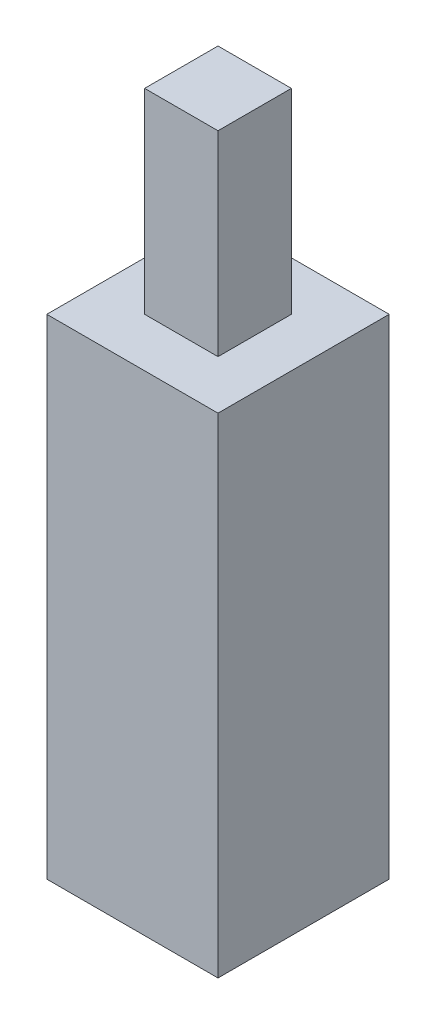
ISO-10303-21;
HEADER;
FILE_DESCRIPTION(('STEP AP214'),'2;1');
FILE_NAME('part.step','',(''),(''),'','','');
FILE_SCHEMA(('AUTOMOTIVE_DESIGN { 1 0 10303 214 1 1 1 1 }'));
ENDSEC;
DATA;
#1=APPLICATION_CONTEXT('core data for automotive mechanical design processes');
#2=APPLICATION_PROTOCOL_DEFINITION('international standard','automotive_design',2000,#1);
#3=PRODUCT_CONTEXT('',#1,'mechanical');
#4=PRODUCT('Part','Part','',(#3));
#5=PRODUCT_RELATED_PRODUCT_CATEGORY('part','',(#4));
#6=PRODUCT_DEFINITION_FORMATION('','',#4);
#7=PRODUCT_DEFINITION_CONTEXT('part definition',#1,'design');
#8=PRODUCT_DEFINITION('design','',#6,#7);
#9=PRODUCT_DEFINITION_SHAPE('','',#8);
#10=(LENGTH_UNIT() NAMED_UNIT(*) SI_UNIT(.MILLI.,.METRE.));
#11=(NAMED_UNIT(*) PLANE_ANGLE_UNIT() SI_UNIT($,.RADIAN.));
#12=(NAMED_UNIT(*) SI_UNIT($,.STERADIAN.) SOLID_ANGLE_UNIT());
#13=UNCERTAINTY_MEASURE_WITH_UNIT(LENGTH_MEASURE(1.E-05),#10,'distance_accuracy_value','');
#14=(GEOMETRIC_REPRESENTATION_CONTEXT(3) GLOBAL_UNCERTAINTY_ASSIGNED_CONTEXT((#13)) GLOBAL_UNIT_ASSIGNED_CONTEXT((#10,
#11,#12)) REPRESENTATION_CONTEXT('',''));
#15=CARTESIAN_POINT('',(0.,0.,0.));
#16=DIRECTION('',(0.,0.,1.));
#17=DIRECTION('',(1.,0.,0.));
#18=AXIS2_PLACEMENT_3D('',#15,#16,#17);
#19=CARTESIAN_POINT('',(0.,20.,0.));
#20=DIRECTION('',(0.,-1.,0.));
#21=DIRECTION('',(0.,0.,-1.));
#22=AXIS2_PLACEMENT_3D('',#19,#20,#21);
#23=PLANE('',#22);
#24=DIRECTION('',(0.,0.,1.));
#25=VECTOR('',#24,1.);
#26=CARTESIAN_POINT('',(0.,20.,0.));
#27=LINE('',#26,#25);
#28=CARTESIAN_POINT('',(0.,20.,-7.));
#29=VERTEX_POINT('',#28);
#30=CARTESIAN_POINT('',(0.,20.,0.));
#31=VERTEX_POINT('',#30);
#32=EDGE_CURVE('E127',#29,#31,#27,.T.);
#33=ORIENTED_EDGE('',*,*,#32,.T.);
#34=DIRECTION('',(1.,0.,0.));
#35=VECTOR('',#34,1.);
#36=CARTESIAN_POINT('',(0.,20.,0.));
#37=LINE('',#36,#35);
#38=CARTESIAN_POINT('',(7.,20.,0.));
#39=VERTEX_POINT('',#38);
#40=EDGE_CURVE('E130',#31,#39,#37,.T.);
#41=ORIENTED_EDGE('',*,*,#40,.T.);
#42=DIRECTION('',(0.,0.,-1.));
#43=VECTOR('',#42,1.);
#44=CARTESIAN_POINT('',(7.,20.,0.));
#45=LINE('',#44,#43);
#46=CARTESIAN_POINT('',(7.,20.,-7.));
#47=VERTEX_POINT('',#46);
#48=EDGE_CURVE('E133',#39,#47,#45,.T.);
#49=ORIENTED_EDGE('',*,*,#48,.T.);
#50=DIRECTION('',(-1.,0.,0.));
#51=VECTOR('',#50,1.);
#52=CARTESIAN_POINT('',(0.,20.,-7.));
#53=LINE('',#52,#51);
#54=EDGE_CURVE('E135',#47,#29,#53,.T.);
#55=ORIENTED_EDGE('',*,*,#54,.T.);
#56=EDGE_LOOP('',(#33,#41,#49,#55));
#57=FACE_BOUND('',#56,.T.);
#58=DIRECTION('',(0.,0.,1.));
#59=VECTOR('',#58,1.);
#60=CARTESIAN_POINT('',(2.,20.,-2.));
#61=LINE('',#60,#59);
#62=CARTESIAN_POINT('',(2.,20.,-5.));
#63=VERTEX_POINT('',#62);
#64=CARTESIAN_POINT('',(2.,20.,-2.));
#65=VERTEX_POINT('',#64);
#66=EDGE_CURVE('E48',#63,#65,#61,.T.);
#67=ORIENTED_EDGE('',*,*,#66,.F.);
#68=DIRECTION('',(-1.,0.,0.));
#69=VECTOR('',#68,1.);
#70=CARTESIAN_POINT('',(2.,20.,-5.));
#71=LINE('',#70,#69);
#72=CARTESIAN_POINT('',(5.,20.,-5.));
#73=VERTEX_POINT('',#72);
#74=EDGE_CURVE('E52',#73,#63,#71,.T.);
#75=ORIENTED_EDGE('',*,*,#74,.F.);
#76=DIRECTION('',(0.,0.,-1.));
#77=VECTOR('',#76,1.);
#78=CARTESIAN_POINT('',(5.,20.,-2.));
#79=LINE('',#78,#77);
#80=CARTESIAN_POINT('',(5.,20.,-2.));
#81=VERTEX_POINT('',#80);
#82=EDGE_CURVE('E260',#81,#73,#79,.T.);
#83=ORIENTED_EDGE('',*,*,#82,.F.);
#84=DIRECTION('',(1.,0.,0.));
#85=VECTOR('',#84,1.);
#86=CARTESIAN_POINT('',(2.,20.,-2.));
#87=LINE('',#86,#85);
#88=EDGE_CURVE('E266',#65,#81,#87,.T.);
#89=ORIENTED_EDGE('',*,*,#88,.F.);
#90=EDGE_LOOP('',(#67,#75,#83,#89));
#91=FACE_BOUND('',#90,.T.);
#92=ADVANCED_FACE('F33',(#57,#91),#23,.F.);
#93=CARTESIAN_POINT('',(0.,20.,0.));
#94=DIRECTION('',(1.,0.,0.));
#95=DIRECTION('',(0.,0.,-1.));
#96=AXIS2_PLACEMENT_3D('',#93,#94,#95);
#97=PLANE('',#96);
#98=DIRECTION('',(0.,0.,1.));
#99=VECTOR('',#98,1.);
#100=CARTESIAN_POINT('',(0.,0.,0.));
#101=LINE('',#100,#99);
#102=CARTESIAN_POINT('',(0.,0.,-7.));
#103=VERTEX_POINT('',#102);
#104=CARTESIAN_POINT('',(0.,0.,0.));
#105=VERTEX_POINT('',#104);
#106=EDGE_CURVE('E118',#103,#105,#101,.T.);
#107=ORIENTED_EDGE('',*,*,#106,.T.);
#108=DIRECTION('',(0.,-1.,0.));
#109=VECTOR('',#108,1.);
#110=CARTESIAN_POINT('',(0.,20.,0.));
#111=LINE('',#110,#109);
#112=EDGE_CURVE('E11',#31,#105,#111,.T.);
#113=ORIENTED_EDGE('',*,*,#112,.F.);
#114=ORIENTED_EDGE('',*,*,#32,.F.);
#115=DIRECTION('',(0.,-1.,0.));
#116=VECTOR('',#115,1.);
#117=CARTESIAN_POINT('',(0.,20.,-7.));
#118=LINE('',#117,#116);
#119=EDGE_CURVE('E136',#29,#103,#118,.T.);
#120=ORIENTED_EDGE('',*,*,#119,.T.);
#121=EDGE_LOOP('',(#107,#113,#114,#120));
#122=FACE_BOUND('',#121,.T.);
#123=ADVANCED_FACE('F35',(#122),#97,.F.);
#124=CARTESIAN_POINT('',(0.,20.,0.));
#125=DIRECTION('',(0.,0.,-1.));
#126=DIRECTION('',(-1.,0.,0.));
#127=AXIS2_PLACEMENT_3D('',#124,#125,#126);
#128=PLANE('',#127);
#129=DIRECTION('',(1.,0.,0.));
#130=VECTOR('',#129,1.);
#131=CARTESIAN_POINT('',(0.,0.,0.));
#132=LINE('',#131,#130);
#133=CARTESIAN_POINT('',(7.,0.,0.));
#134=VERTEX_POINT('',#133);
#135=EDGE_CURVE('E121',#105,#134,#132,.T.);
#136=ORIENTED_EDGE('',*,*,#135,.T.);
#137=DIRECTION('',(0.,-1.,0.));
#138=VECTOR('',#137,1.);
#139=CARTESIAN_POINT('',(7.,20.,0.));
#140=LINE('',#139,#138);
#141=EDGE_CURVE('E41',#39,#134,#140,.T.);
#142=ORIENTED_EDGE('',*,*,#141,.F.);
#143=ORIENTED_EDGE('',*,*,#40,.F.);
#144=ORIENTED_EDGE('',*,*,#112,.T.);
#145=EDGE_LOOP('',(#136,#142,#143,#144));
#146=FACE_BOUND('',#145,.T.);
#147=ADVANCED_FACE('F166',(#146),#128,.F.);
#148=CARTESIAN_POINT('',(7.,20.,0.));
#149=DIRECTION('',(-1.,0.,0.));
#150=DIRECTION('',(0.,0.,1.));
#151=AXIS2_PLACEMENT_3D('',#148,#149,#150);
#152=PLANE('',#151);
#153=DIRECTION('',(0.,0.,-1.));
#154=VECTOR('',#153,1.);
#155=CARTESIAN_POINT('',(7.,0.,0.));
#156=LINE('',#155,#154);
#157=CARTESIAN_POINT('',(7.,0.,-7.));
#158=VERTEX_POINT('',#157);
#159=EDGE_CURVE('E139',#134,#158,#156,.T.);
#160=ORIENTED_EDGE('',*,*,#159,.T.);
#161=DIRECTION('',(0.,-1.,0.));
#162=VECTOR('',#161,1.);
#163=CARTESIAN_POINT('',(7.,20.,-7.));
#164=LINE('',#163,#162);
#165=EDGE_CURVE('E144',#47,#158,#164,.T.);
#166=ORIENTED_EDGE('',*,*,#165,.F.);
#167=ORIENTED_EDGE('',*,*,#48,.F.);
#168=ORIENTED_EDGE('',*,*,#141,.T.);
#169=EDGE_LOOP('',(#160,#166,#167,#168));
#170=FACE_BOUND('',#169,.T.);
#171=ADVANCED_FACE('F151',(#170),#152,.F.);
#172=CARTESIAN_POINT('',(0.,20.,-7.));
#173=DIRECTION('',(0.,0.,1.));
#174=DIRECTION('',(1.,0.,0.));
#175=AXIS2_PLACEMENT_3D('',#172,#173,#174);
#176=PLANE('',#175);
#177=DIRECTION('',(-1.,0.,0.));
#178=VECTOR('',#177,1.);
#179=CARTESIAN_POINT('',(0.,0.,-7.));
#180=LINE('',#179,#178);
#181=EDGE_CURVE('E131',#158,#103,#180,.T.);
#182=ORIENTED_EDGE('',*,*,#181,.T.);
#183=ORIENTED_EDGE('',*,*,#119,.F.);
#184=ORIENTED_EDGE('',*,*,#54,.F.);
#185=ORIENTED_EDGE('',*,*,#165,.T.);
#186=EDGE_LOOP('',(#182,#183,#184,#185));
#187=FACE_BOUND('',#186,.T.);
#188=ADVANCED_FACE('F160',(#187),#176,.F.);
#189=CARTESIAN_POINT('',(0.,0.,0.));
#190=DIRECTION('',(0.,-1.,0.));
#191=DIRECTION('',(0.,0.,-1.));
#192=AXIS2_PLACEMENT_3D('',#189,#190,#191);
#193=PLANE('',#192);
#194=ORIENTED_EDGE('',*,*,#106,.F.);
#195=ORIENTED_EDGE('',*,*,#181,.F.);
#196=ORIENTED_EDGE('',*,*,#159,.F.);
#197=ORIENTED_EDGE('',*,*,#135,.F.);
#198=EDGE_LOOP('',(#194,#195,#196,#197));
#199=FACE_BOUND('',#198,.T.);
#200=ADVANCED_FACE('F157',(#199),#193,.T.);
#201=CARTESIAN_POINT('',(2.,28.,-2.));
#202=DIRECTION('',(1.,0.,0.));
#203=DIRECTION('',(0.,0.,-1.));
#204=AXIS2_PLACEMENT_3D('',#201,#202,#203);
#205=PLANE('',#204);
#206=ORIENTED_EDGE('',*,*,#66,.T.);
#207=DIRECTION('',(0.,-1.,0.));
#208=VECTOR('',#207,1.);
#209=CARTESIAN_POINT('',(2.,28.,-2.));
#210=LINE('',#209,#208);
#211=CARTESIAN_POINT('',(2.,28.,-2.));
#212=VERTEX_POINT('',#211);
#213=EDGE_CURVE('E101',#212,#65,#210,.T.);
#214=ORIENTED_EDGE('',*,*,#213,.F.);
#215=DIRECTION('',(0.,0.,1.));
#216=VECTOR('',#215,1.);
#217=CARTESIAN_POINT('',(2.,28.,-2.));
#218=LINE('',#217,#216);
#219=CARTESIAN_POINT('',(2.,28.,-5.));
#220=VERTEX_POINT('',#219);
#221=EDGE_CURVE('E107',#220,#212,#218,.T.);
#222=ORIENTED_EDGE('',*,*,#221,.F.);
#223=DIRECTION('',(0.,-1.,0.));
#224=VECTOR('',#223,1.);
#225=CARTESIAN_POINT('',(2.,28.,-5.));
#226=LINE('',#225,#224);
#227=EDGE_CURVE('E258',#220,#63,#226,.T.);
#228=ORIENTED_EDGE('',*,*,#227,.T.);
#229=EDGE_LOOP('',(#206,#214,#222,#228));
#230=FACE_BOUND('',#229,.T.);
#231=ADVANCED_FACE('F117',(#230),#205,.F.);
#232=CARTESIAN_POINT('',(2.,28.,-2.));
#233=DIRECTION('',(0.,0.,-1.));
#234=DIRECTION('',(-1.,0.,0.));
#235=AXIS2_PLACEMENT_3D('',#232,#233,#234);
#236=PLANE('',#235);
#237=ORIENTED_EDGE('',*,*,#88,.T.);
#238=DIRECTION('',(0.,-1.,0.));
#239=VECTOR('',#238,1.);
#240=CARTESIAN_POINT('',(5.,28.,-2.));
#241=LINE('',#240,#239);
#242=CARTESIAN_POINT('',(5.,28.,-2.));
#243=VERTEX_POINT('',#242);
#244=EDGE_CURVE('E103',#243,#81,#241,.T.);
#245=ORIENTED_EDGE('',*,*,#244,.F.);
#246=DIRECTION('',(1.,0.,0.));
#247=VECTOR('',#246,1.);
#248=CARTESIAN_POINT('',(2.,28.,-2.));
#249=LINE('',#248,#247);
#250=EDGE_CURVE('E96',#212,#243,#249,.T.);
#251=ORIENTED_EDGE('',*,*,#250,.F.);
#252=ORIENTED_EDGE('',*,*,#213,.T.);
#253=EDGE_LOOP('',(#237,#245,#251,#252));
#254=FACE_BOUND('',#253,.T.);
#255=ADVANCED_FACE('F99',(#254),#236,.F.);
#256=CARTESIAN_POINT('',(5.,28.,-2.));
#257=DIRECTION('',(-1.,0.,0.));
#258=DIRECTION('',(0.,0.,1.));
#259=AXIS2_PLACEMENT_3D('',#256,#257,#258);
#260=PLANE('',#259);
#261=ORIENTED_EDGE('',*,*,#82,.T.);
#262=DIRECTION('',(0.,-1.,0.));
#263=VECTOR('',#262,1.);
#264=CARTESIAN_POINT('',(5.,28.,-5.));
#265=LINE('',#264,#263);
#266=CARTESIAN_POINT('',(5.,28.,-5.));
#267=VERTEX_POINT('',#266);
#268=EDGE_CURVE('E123',#267,#73,#265,.T.);
#269=ORIENTED_EDGE('',*,*,#268,.F.);
#270=DIRECTION('',(0.,0.,-1.));
#271=VECTOR('',#270,1.);
#272=CARTESIAN_POINT('',(5.,28.,-2.));
#273=LINE('',#272,#271);
#274=EDGE_CURVE('E106',#243,#267,#273,.T.);
#275=ORIENTED_EDGE('',*,*,#274,.F.);
#276=ORIENTED_EDGE('',*,*,#244,.T.);
#277=EDGE_LOOP('',(#261,#269,#275,#276));
#278=FACE_BOUND('',#277,.T.);
#279=ADVANCED_FACE('F202',(#278),#260,.F.);
#280=CARTESIAN_POINT('',(2.,28.,-5.));
#281=DIRECTION('',(0.,0.,1.));
#282=DIRECTION('',(1.,0.,0.));
#283=AXIS2_PLACEMENT_3D('',#280,#281,#282);
#284=PLANE('',#283);
#285=ORIENTED_EDGE('',*,*,#74,.T.);
#286=ORIENTED_EDGE('',*,*,#227,.F.);
#287=DIRECTION('',(-1.,0.,0.));
#288=VECTOR('',#287,1.);
#289=CARTESIAN_POINT('',(2.,28.,-5.));
#290=LINE('',#289,#288);
#291=EDGE_CURVE('E112',#267,#220,#290,.T.);
#292=ORIENTED_EDGE('',*,*,#291,.F.);
#293=ORIENTED_EDGE('',*,*,#268,.T.);
#294=EDGE_LOOP('',(#285,#286,#292,#293));
#295=FACE_BOUND('',#294,.T.);
#296=ADVANCED_FACE('F208',(#295),#284,.F.);
#297=CARTESIAN_POINT('',(0.,28.,0.));
#298=DIRECTION('',(0.,-1.,0.));
#299=DIRECTION('',(0.,0.,-1.));
#300=AXIS2_PLACEMENT_3D('',#297,#298,#299);
#301=PLANE('',#300);
#302=ORIENTED_EDGE('',*,*,#221,.T.);
#303=ORIENTED_EDGE('',*,*,#250,.T.);
#304=ORIENTED_EDGE('',*,*,#274,.T.);
#305=ORIENTED_EDGE('',*,*,#291,.T.);
#306=EDGE_LOOP('',(#302,#303,#304,#305));
#307=FACE_BOUND('',#306,.T.);
#308=ADVANCED_FACE('F110',(#307),#301,.F.);
#309=CLOSED_SHELL('',(#92,#123,#147,#171,#188,#200,#231,#255,#279,#296,#308));
#310=MANIFOLD_SOLID_BREP('B2',#309);
#311=ADVANCED_BREP_SHAPE_REPRESENTATION('',(#18,#310),#14);
#312=SHAPE_DEFINITION_REPRESENTATION(#9,#311);
ENDSEC;
END-ISO-10303-21;
